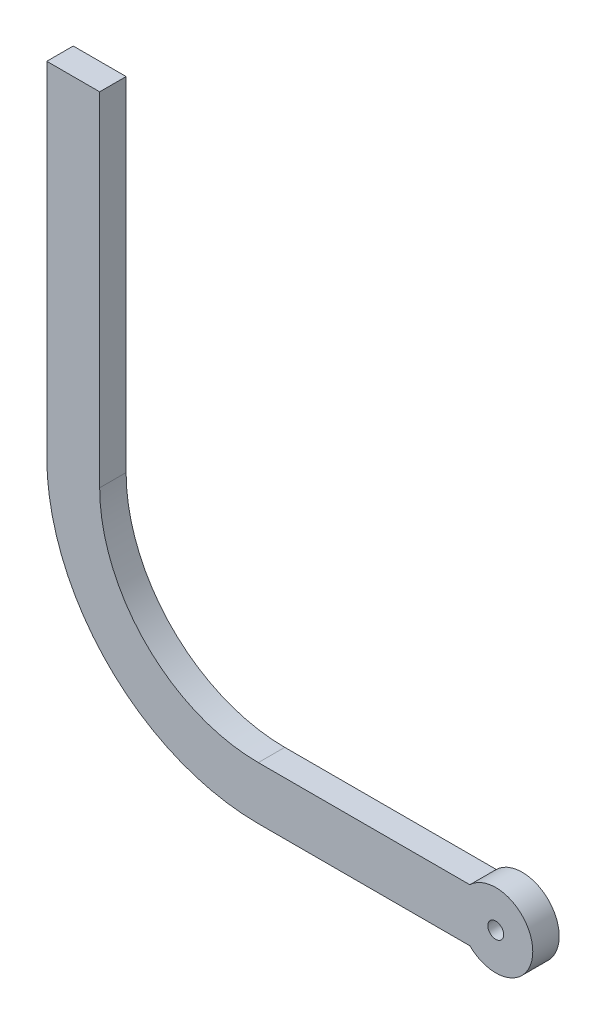
ISO-10303-21;
HEADER;
FILE_DESCRIPTION(('STEP AP214'),'2;1');
FILE_NAME('part.step','',(''),(''),'','','');
FILE_SCHEMA(('AUTOMOTIVE_DESIGN { 1 0 10303 214 1 1 1 1 }'));
ENDSEC;
DATA;
#1=APPLICATION_CONTEXT('core data for automotive mechanical design processes');
#2=APPLICATION_PROTOCOL_DEFINITION('international standard','automotive_design',2000,#1);
#3=PRODUCT_CONTEXT('',#1,'mechanical');
#4=PRODUCT('Part','Part','',(#3));
#5=PRODUCT_RELATED_PRODUCT_CATEGORY('part','',(#4));
#6=PRODUCT_DEFINITION_FORMATION('','',#4);
#7=PRODUCT_DEFINITION_CONTEXT('part definition',#1,'design');
#8=PRODUCT_DEFINITION('design','',#6,#7);
#9=PRODUCT_DEFINITION_SHAPE('','',#8);
#10=(LENGTH_UNIT() NAMED_UNIT(*) SI_UNIT(.MILLI.,.METRE.));
#11=(NAMED_UNIT(*) PLANE_ANGLE_UNIT() SI_UNIT($,.RADIAN.));
#12=(NAMED_UNIT(*) SI_UNIT($,.STERADIAN.) SOLID_ANGLE_UNIT());
#13=UNCERTAINTY_MEASURE_WITH_UNIT(LENGTH_MEASURE(1.E-05),#10,'distance_accuracy_value','');
#14=(GEOMETRIC_REPRESENTATION_CONTEXT(3) GLOBAL_UNCERTAINTY_ASSIGNED_CONTEXT((#13)) GLOBAL_UNIT_ASSIGNED_CONTEXT((#10,
#11,#12)) REPRESENTATION_CONTEXT('',''));
#15=CARTESIAN_POINT('',(0.,0.,0.));
#16=DIRECTION('',(0.,0.,1.));
#17=DIRECTION('',(1.,0.,0.));
#18=AXIS2_PLACEMENT_3D('',#15,#16,#17);
#19=CARTESIAN_POINT('',(-44.8989794855664,35.,5.));
#20=DIRECTION('',(0.,0.,1.));
#21=DIRECTION('',(1.,0.,0.));
#22=AXIS2_PLACEMENT_3D('',#19,#20,#21);
#23=PLANE('',#22);
#24=CARTESIAN_POINT('',(-44.8989794855664,35.,5.));
#25=DIRECTION('',(0.,0.,-1.));
#26=DIRECTION('',(1.,0.,0.));
#27=AXIS2_PLACEMENT_3D('',#24,#25,#26);
#28=CIRCLE('',#27,30.);
#29=CARTESIAN_POINT('',(-44.8989794855664,4.99999999999999,5.));
#30=VERTEX_POINT('',#29);
#31=CARTESIAN_POINT('',(-74.8989794855664,35.,5.));
#32=VERTEX_POINT('',#31);
#33=EDGE_CURVE('E144',#30,#32,#28,.T.);
#34=ORIENTED_EDGE('',*,*,#33,.T.);
#35=DIRECTION('',(0.,1.,0.));
#36=VECTOR('',#35,1.);
#37=CARTESIAN_POINT('',(-74.8989794855664,35.,5.));
#38=LINE('',#37,#36);
#39=CARTESIAN_POINT('',(-74.8989794855664,99.854241237868,5.));
#40=VERTEX_POINT('',#39);
#41=EDGE_CURVE('E92',#32,#40,#38,.T.);
#42=ORIENTED_EDGE('',*,*,#41,.T.);
#43=DIRECTION('',(-1.,0.,0.));
#44=VECTOR('',#43,1.);
#45=CARTESIAN_POINT('',(-74.8989794855664,99.854241237868,5.));
#46=LINE('',#45,#44);
#47=CARTESIAN_POINT('',(-84.8989794855664,99.854241237868,5.));
#48=VERTEX_POINT('',#47);
#49=EDGE_CURVE('E159',#40,#48,#46,.T.);
#50=ORIENTED_EDGE('',*,*,#49,.T.);
#51=DIRECTION('',(0.,-1.,0.));
#52=VECTOR('',#51,1.);
#53=CARTESIAN_POINT('',(-84.8989794855664,99.854241237868,5.));
#54=LINE('',#53,#52);
#55=CARTESIAN_POINT('',(-84.8989794855663,35.,5.));
#56=VERTEX_POINT('',#55);
#57=EDGE_CURVE('E172',#48,#56,#54,.T.);
#58=ORIENTED_EDGE('',*,*,#57,.T.);
#59=CARTESIAN_POINT('',(-44.8989794855664,35.,5.));
#60=DIRECTION('',(0.,0.,1.));
#61=DIRECTION('',(1.,0.,0.));
#62=AXIS2_PLACEMENT_3D('',#59,#60,#61);
#63=CIRCLE('',#62,40.);
#64=CARTESIAN_POINT('',(-44.8989794855664,-5.,5.));
#65=VERTEX_POINT('',#64);
#66=EDGE_CURVE('E111',#56,#65,#63,.T.);
#67=ORIENTED_EDGE('',*,*,#66,.T.);
#68=DIRECTION('',(1.,0.,0.));
#69=VECTOR('',#68,1.);
#70=CARTESIAN_POINT('',(-44.8989794855664,-5.,5.));
#71=LINE('',#70,#69);
#72=CARTESIAN_POINT('',(-4.89897948556636,-5.,5.));
#73=VERTEX_POINT('',#72);
#74=EDGE_CURVE('E105',#65,#73,#71,.T.);
#75=ORIENTED_EDGE('',*,*,#74,.T.);
#76=CARTESIAN_POINT('',(0.,0.,5.));
#77=DIRECTION('',(0.,0.,1.));
#78=DIRECTION('',(1.,0.,0.));
#79=AXIS2_PLACEMENT_3D('',#76,#77,#78);
#80=CIRCLE('',#79,7.);
#81=CARTESIAN_POINT('',(-4.89897948556636,5.,5.));
#82=VERTEX_POINT('',#81);
#83=EDGE_CURVE('E109',#73,#82,#80,.T.);
#84=ORIENTED_EDGE('',*,*,#83,.T.);
#85=DIRECTION('',(-1.,0.,0.));
#86=VECTOR('',#85,1.);
#87=CARTESIAN_POINT('',(-4.89897948556636,5.,5.));
#88=LINE('',#87,#86);
#89=EDGE_CURVE('E49',#82,#30,#88,.T.);
#90=ORIENTED_EDGE('',*,*,#89,.T.);
#91=EDGE_LOOP('',(#34,#42,#50,#58,#67,#75,#84,#90));
#92=FACE_BOUND('',#91,.T.);
#93=CARTESIAN_POINT('',(0.,0.,5.));
#94=DIRECTION('',(0.,0.,1.));
#95=DIRECTION('',(1.,0.,0.));
#96=AXIS2_PLACEMENT_3D('',#93,#94,#95);
#97=CIRCLE('',#96,1.5);
#98=CARTESIAN_POINT('',(1.5,0.,5.));
#99=VERTEX_POINT('',#98);
#100=EDGE_CURVE('E133',#99,#99,#97,.T.);
#101=ORIENTED_EDGE('',*,*,#100,.F.);
#102=EDGE_LOOP('',(#101));
#103=FACE_BOUND('',#102,.T.);
#104=ADVANCED_FACE('F32',(#92,#103),#23,.T.);
#105=CARTESIAN_POINT('',(-44.8989794855664,35.,0.));
#106=DIRECTION('',(0.,0.,1.));
#107=DIRECTION('',(1.,0.,0.));
#108=AXIS2_PLACEMENT_3D('',#105,#106,#107);
#109=PLANE('',#108);
#110=CARTESIAN_POINT('',(-44.8989794855664,35.,0.));
#111=DIRECTION('',(0.,0.,-1.));
#112=DIRECTION('',(1.,0.,0.));
#113=AXIS2_PLACEMENT_3D('',#110,#111,#112);
#114=CIRCLE('',#113,30.);
#115=CARTESIAN_POINT('',(-44.8989794855664,4.99999999999999,0.));
#116=VERTEX_POINT('',#115);
#117=CARTESIAN_POINT('',(-74.8989794855664,35.,0.));
#118=VERTEX_POINT('',#117);
#119=EDGE_CURVE('E129',#116,#118,#114,.T.);
#120=ORIENTED_EDGE('',*,*,#119,.F.);
#121=DIRECTION('',(-1.,0.,0.));
#122=VECTOR('',#121,1.);
#123=CARTESIAN_POINT('',(-4.89897948556636,5.,0.));
#124=LINE('',#123,#122);
#125=CARTESIAN_POINT('',(-4.89897948556636,5.,0.));
#126=VERTEX_POINT('',#125);
#127=EDGE_CURVE('E84',#126,#116,#124,.T.);
#128=ORIENTED_EDGE('',*,*,#127,.F.);
#129=CARTESIAN_POINT('',(0.,0.,0.));
#130=DIRECTION('',(0.,0.,1.));
#131=DIRECTION('',(1.,0.,0.));
#132=AXIS2_PLACEMENT_3D('',#129,#130,#131);
#133=CIRCLE('',#132,7.);
#134=CARTESIAN_POINT('',(-4.89897948556636,-5.,0.));
#135=VERTEX_POINT('',#134);
#136=EDGE_CURVE('E78',#135,#126,#133,.T.);
#137=ORIENTED_EDGE('',*,*,#136,.F.);
#138=DIRECTION('',(1.,0.,0.));
#139=VECTOR('',#138,1.);
#140=CARTESIAN_POINT('',(-44.8989794855664,-5.,0.));
#141=LINE('',#140,#139);
#142=CARTESIAN_POINT('',(-44.8989794855664,-5.,0.));
#143=VERTEX_POINT('',#142);
#144=EDGE_CURVE('E119',#143,#135,#141,.T.);
#145=ORIENTED_EDGE('',*,*,#144,.F.);
#146=CARTESIAN_POINT('',(-44.8989794855664,35.,0.));
#147=DIRECTION('',(0.,0.,1.));
#148=DIRECTION('',(1.,0.,0.));
#149=AXIS2_PLACEMENT_3D('',#146,#147,#148);
#150=CIRCLE('',#149,40.);
#151=CARTESIAN_POINT('',(-84.8989794855663,35.,0.));
#152=VERTEX_POINT('',#151);
#153=EDGE_CURVE('E139',#152,#143,#150,.T.);
#154=ORIENTED_EDGE('',*,*,#153,.F.);
#155=DIRECTION('',(0.,-1.,0.));
#156=VECTOR('',#155,1.);
#157=CARTESIAN_POINT('',(-84.8989794855664,99.854241237868,0.));
#158=LINE('',#157,#156);
#159=CARTESIAN_POINT('',(-84.8989794855664,99.854241237868,0.));
#160=VERTEX_POINT('',#159);
#161=EDGE_CURVE('E137',#160,#152,#158,.T.);
#162=ORIENTED_EDGE('',*,*,#161,.F.);
#163=DIRECTION('',(-1.,0.,0.));
#164=VECTOR('',#163,1.);
#165=CARTESIAN_POINT('',(-74.8989794855664,99.854241237868,0.));
#166=LINE('',#165,#164);
#167=CARTESIAN_POINT('',(-74.8989794855664,99.854241237868,0.));
#168=VERTEX_POINT('',#167);
#169=EDGE_CURVE('E135',#168,#160,#166,.T.);
#170=ORIENTED_EDGE('',*,*,#169,.F.);
#171=DIRECTION('',(0.,1.,0.));
#172=VECTOR('',#171,1.);
#173=CARTESIAN_POINT('',(-74.8989794855664,35.,0.));
#174=LINE('',#173,#172);
#175=EDGE_CURVE('E132',#118,#168,#174,.T.);
#176=ORIENTED_EDGE('',*,*,#175,.F.);
#177=EDGE_LOOP('',(#120,#128,#137,#145,#154,#162,#170,#176));
#178=FACE_BOUND('',#177,.T.);
#179=CARTESIAN_POINT('',(0.,0.,0.));
#180=DIRECTION('',(0.,0.,1.));
#181=DIRECTION('',(1.,0.,0.));
#182=AXIS2_PLACEMENT_3D('',#179,#180,#181);
#183=CIRCLE('',#182,1.5);
#184=CARTESIAN_POINT('',(1.5,0.,0.));
#185=VERTEX_POINT('',#184);
#186=EDGE_CURVE('E178',#185,#185,#183,.T.);
#187=ORIENTED_EDGE('',*,*,#186,.T.);
#188=EDGE_LOOP('',(#187));
#189=FACE_BOUND('',#188,.T.);
#190=ADVANCED_FACE('F163',(#178,#189),#109,.F.);
#191=CARTESIAN_POINT('',(-44.8989794855664,35.,5.));
#192=DIRECTION('',(0.,0.,-1.));
#193=DIRECTION('',(-1.,0.,0.));
#194=AXIS2_PLACEMENT_3D('',#191,#192,#193);
#195=CYLINDRICAL_SURFACE('',#194,30.);
#196=ORIENTED_EDGE('',*,*,#119,.T.);
#197=DIRECTION('',(0.,0.,-1.));
#198=VECTOR('',#197,1.);
#199=CARTESIAN_POINT('',(-74.8989794855664,35.,5.));
#200=LINE('',#199,#198);
#201=EDGE_CURVE('E11',#32,#118,#200,.T.);
#202=ORIENTED_EDGE('',*,*,#201,.F.);
#203=ORIENTED_EDGE('',*,*,#33,.F.);
#204=DIRECTION('',(0.,0.,-1.));
#205=VECTOR('',#204,1.);
#206=CARTESIAN_POINT('',(-44.8989794855664,4.99999999999999,5.));
#207=LINE('',#206,#205);
#208=EDGE_CURVE('E125',#30,#116,#207,.T.);
#209=ORIENTED_EDGE('',*,*,#208,.T.);
#210=EDGE_LOOP('',(#196,#202,#203,#209));
#211=FACE_BOUND('',#210,.T.);
#212=ADVANCED_FACE('F34',(#211),#195,.F.);
#213=CARTESIAN_POINT('',(-74.8989794855664,35.,5.));
#214=DIRECTION('',(-1.,0.,0.));
#215=DIRECTION('',(0.,-1.,0.));
#216=AXIS2_PLACEMENT_3D('',#213,#214,#215);
#217=PLANE('',#216);
#218=ORIENTED_EDGE('',*,*,#175,.T.);
#219=DIRECTION('',(0.,0.,-1.));
#220=VECTOR('',#219,1.);
#221=CARTESIAN_POINT('',(-74.8989794855664,99.854241237868,5.));
#222=LINE('',#221,#220);
#223=EDGE_CURVE('E41',#40,#168,#222,.T.);
#224=ORIENTED_EDGE('',*,*,#223,.F.);
#225=ORIENTED_EDGE('',*,*,#41,.F.);
#226=ORIENTED_EDGE('',*,*,#201,.T.);
#227=EDGE_LOOP('',(#218,#224,#225,#226));
#228=FACE_BOUND('',#227,.T.);
#229=ADVANCED_FACE('F206',(#228),#217,.F.);
#230=CARTESIAN_POINT('',(-74.8989794855664,99.854241237868,5.));
#231=DIRECTION('',(0.,-1.,0.));
#232=DIRECTION('',(0.,0.,-1.));
#233=AXIS2_PLACEMENT_3D('',#230,#231,#232);
#234=PLANE('',#233);
#235=ORIENTED_EDGE('',*,*,#169,.T.);
#236=DIRECTION('',(0.,0.,-1.));
#237=VECTOR('',#236,1.);
#238=CARTESIAN_POINT('',(-84.8989794855664,99.854241237868,5.));
#239=LINE('',#238,#237);
#240=EDGE_CURVE('E151',#48,#160,#239,.T.);
#241=ORIENTED_EDGE('',*,*,#240,.F.);
#242=ORIENTED_EDGE('',*,*,#49,.F.);
#243=ORIENTED_EDGE('',*,*,#223,.T.);
#244=EDGE_LOOP('',(#235,#241,#242,#243));
#245=FACE_BOUND('',#244,.T.);
#246=ADVANCED_FACE('F157',(#245),#234,.F.);
#247=CARTESIAN_POINT('',(-84.8989794855664,99.854241237868,5.));
#248=DIRECTION('',(1.,0.,0.));
#249=DIRECTION('',(0.,1.,0.));
#250=AXIS2_PLACEMENT_3D('',#247,#248,#249);
#251=PLANE('',#250);
#252=ORIENTED_EDGE('',*,*,#161,.T.);
#253=DIRECTION('',(0.,0.,-1.));
#254=VECTOR('',#253,1.);
#255=CARTESIAN_POINT('',(-84.8989794855663,35.,5.));
#256=LINE('',#255,#254);
#257=EDGE_CURVE('E148',#56,#152,#256,.T.);
#258=ORIENTED_EDGE('',*,*,#257,.F.);
#259=ORIENTED_EDGE('',*,*,#57,.F.);
#260=ORIENTED_EDGE('',*,*,#240,.T.);
#261=EDGE_LOOP('',(#252,#258,#259,#260));
#262=FACE_BOUND('',#261,.T.);
#263=ADVANCED_FACE('F168',(#262),#251,.F.);
#264=CARTESIAN_POINT('',(-44.8989794855664,35.,5.));
#265=DIRECTION('',(0.,0.,-1.));
#266=DIRECTION('',(-1.,0.,0.));
#267=AXIS2_PLACEMENT_3D('',#264,#265,#266);
#268=CYLINDRICAL_SURFACE('',#267,40.);
#269=ORIENTED_EDGE('',*,*,#153,.T.);
#270=DIRECTION('',(0.,0.,-1.));
#271=VECTOR('',#270,1.);
#272=CARTESIAN_POINT('',(-44.8989794855664,-5.,5.));
#273=LINE('',#272,#271);
#274=EDGE_CURVE('E120',#65,#143,#273,.T.);
#275=ORIENTED_EDGE('',*,*,#274,.F.);
#276=ORIENTED_EDGE('',*,*,#66,.F.);
#277=ORIENTED_EDGE('',*,*,#257,.T.);
#278=EDGE_LOOP('',(#269,#275,#276,#277));
#279=FACE_BOUND('',#278,.T.);
#280=ADVANCED_FACE('F171',(#279),#268,.T.);
#281=CARTESIAN_POINT('',(-44.8989794855664,-5.,5.));
#282=DIRECTION('',(0.,1.,0.));
#283=DIRECTION('',(-1.,0.,0.));
#284=AXIS2_PLACEMENT_3D('',#281,#282,#283);
#285=PLANE('',#284);
#286=ORIENTED_EDGE('',*,*,#144,.T.);
#287=DIRECTION('',(0.,0.,-1.));
#288=VECTOR('',#287,1.);
#289=CARTESIAN_POINT('',(-4.89897948556636,-5.,5.));
#290=LINE('',#289,#288);
#291=EDGE_CURVE('E116',#73,#135,#290,.T.);
#292=ORIENTED_EDGE('',*,*,#291,.F.);
#293=ORIENTED_EDGE('',*,*,#74,.F.);
#294=ORIENTED_EDGE('',*,*,#274,.T.);
#295=EDGE_LOOP('',(#286,#292,#293,#294));
#296=FACE_BOUND('',#295,.T.);
#297=ADVANCED_FACE('F117',(#296),#285,.F.);
#298=CARTESIAN_POINT('',(0.,0.,5.));
#299=DIRECTION('',(0.,0.,-1.));
#300=DIRECTION('',(-1.,0.,0.));
#301=AXIS2_PLACEMENT_3D('',#298,#299,#300);
#302=CYLINDRICAL_SURFACE('',#301,7.);
#303=ORIENTED_EDGE('',*,*,#136,.T.);
#304=DIRECTION('',(0.,0.,-1.));
#305=VECTOR('',#304,1.);
#306=CARTESIAN_POINT('',(-4.89897948556636,5.,5.));
#307=LINE('',#306,#305);
#308=EDGE_CURVE('E121',#82,#126,#307,.T.);
#309=ORIENTED_EDGE('',*,*,#308,.F.);
#310=ORIENTED_EDGE('',*,*,#83,.F.);
#311=ORIENTED_EDGE('',*,*,#291,.T.);
#312=EDGE_LOOP('',(#303,#309,#310,#311));
#313=FACE_BOUND('',#312,.T.);
#314=ADVANCED_FACE('F123',(#313),#302,.T.);
#315=CARTESIAN_POINT('',(-4.89897948556636,5.,5.));
#316=DIRECTION('',(0.,-1.,0.));
#317=DIRECTION('',(1.,0.,0.));
#318=AXIS2_PLACEMENT_3D('',#315,#316,#317);
#319=PLANE('',#318);
#320=ORIENTED_EDGE('',*,*,#127,.T.);
#321=ORIENTED_EDGE('',*,*,#208,.F.);
#322=ORIENTED_EDGE('',*,*,#89,.F.);
#323=ORIENTED_EDGE('',*,*,#308,.T.);
#324=EDGE_LOOP('',(#320,#321,#322,#323));
#325=FACE_BOUND('',#324,.T.);
#326=ADVANCED_FACE('F194',(#325),#319,.F.);
#327=CARTESIAN_POINT('',(0.,0.,5.));
#328=DIRECTION('',(0.,0.,-1.));
#329=DIRECTION('',(-1.,0.,0.));
#330=AXIS2_PLACEMENT_3D('',#327,#328,#329);
#331=CYLINDRICAL_SURFACE('',#330,1.5);
#332=ORIENTED_EDGE('',*,*,#100,.T.);
#333=EDGE_LOOP('',(#332));
#334=FACE_BOUND('',#333,.T.);
#335=ORIENTED_EDGE('',*,*,#186,.F.);
#336=EDGE_LOOP('',(#335));
#337=FACE_BOUND('',#336,.T.);
#338=ADVANCED_FACE('F184',(#334,#337),#331,.F.);
#339=CLOSED_SHELL('',(#104,#190,#212,#229,#246,#263,#280,#297,#314,#326,#338));
#340=MANIFOLD_SOLID_BREP('B2',#339);
#341=ADVANCED_BREP_SHAPE_REPRESENTATION('',(#18,#340),#14);
#342=SHAPE_DEFINITION_REPRESENTATION(#9,#341);
ENDSEC;
END-ISO-10303-21;
